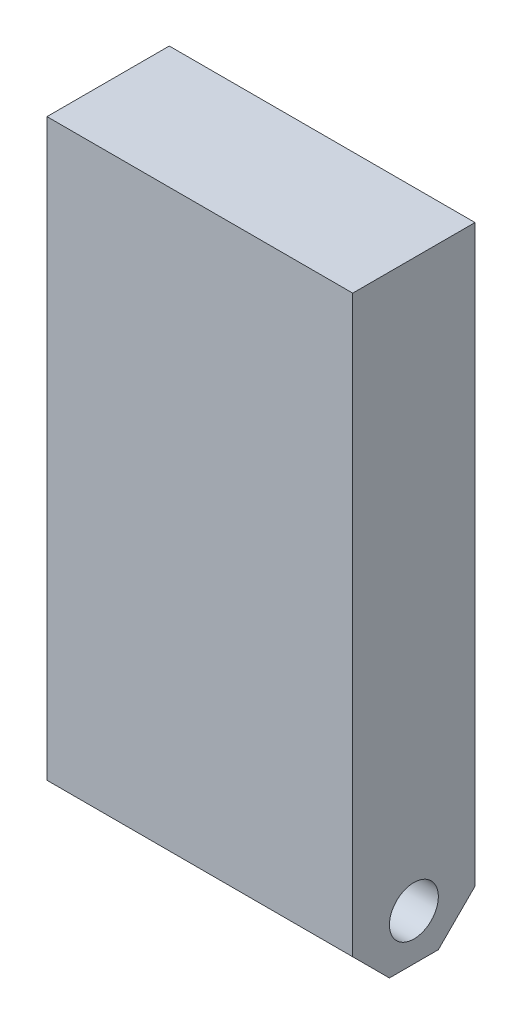
ISO-10303-21;
HEADER;
FILE_DESCRIPTION(('STEP AP214'),'2;1');
FILE_NAME('part.step','',(''),(''),'','','');
FILE_SCHEMA(('AUTOMOTIVE_DESIGN { 1 0 10303 214 1 1 1 1 }'));
ENDSEC;
DATA;
#1=APPLICATION_CONTEXT('core data for automotive mechanical design processes');
#2=APPLICATION_PROTOCOL_DEFINITION('international standard','automotive_design',2000,#1);
#3=PRODUCT_CONTEXT('',#1,'mechanical');
#4=PRODUCT('Part','Part','',(#3));
#5=PRODUCT_RELATED_PRODUCT_CATEGORY('part','',(#4));
#6=PRODUCT_DEFINITION_FORMATION('','',#4);
#7=PRODUCT_DEFINITION_CONTEXT('part definition',#1,'design');
#8=PRODUCT_DEFINITION('design','',#6,#7);
#9=PRODUCT_DEFINITION_SHAPE('','',#8);
#10=(LENGTH_UNIT() NAMED_UNIT(*) SI_UNIT(.MILLI.,.METRE.));
#11=(NAMED_UNIT(*) PLANE_ANGLE_UNIT() SI_UNIT($,.RADIAN.));
#12=(NAMED_UNIT(*) SI_UNIT($,.STERADIAN.) SOLID_ANGLE_UNIT());
#13=UNCERTAINTY_MEASURE_WITH_UNIT(LENGTH_MEASURE(1.E-05),#10,'distance_accuracy_value','');
#14=(GEOMETRIC_REPRESENTATION_CONTEXT(3) GLOBAL_UNCERTAINTY_ASSIGNED_CONTEXT((#13)) GLOBAL_UNIT_ASSIGNED_CONTEXT((#10,
#11,#12)) REPRESENTATION_CONTEXT('',''));
#15=CARTESIAN_POINT('',(0.,0.,0.));
#16=DIRECTION('',(0.,0.,1.));
#17=DIRECTION('',(1.,0.,0.));
#18=AXIS2_PLACEMENT_3D('',#15,#16,#17);
#19=CARTESIAN_POINT('',(25.,0.,10.));
#20=DIRECTION('',(-1.,0.,0.));
#21=DIRECTION('',(0.,-1.,0.));
#22=AXIS2_PLACEMENT_3D('',#19,#20,#21);
#23=PLANE('',#22);
#24=CARTESIAN_POINT('',(25.,7.5225763514201,0.));
#25=DIRECTION('',(-1.,0.,0.));
#26=DIRECTION('',(0.,0.,1.));
#27=AXIS2_PLACEMENT_3D('',#24,#25,#26);
#28=CIRCLE('',#27,4.);
#29=CARTESIAN_POINT('',(25.,7.5225763514201,4.));
#30=VERTEX_POINT('',#29);
#31=EDGE_CURVE('E157',#30,#30,#28,.T.);
#32=ORIENTED_EDGE('',*,*,#31,.T.);
#33=EDGE_LOOP('',(#32));
#34=FACE_BOUND('',#33,.T.);
#35=DIRECTION('',(0.,1.,0.));
#36=VECTOR('',#35,1.);
#37=CARTESIAN_POINT('',(25.,0.,10.));
#38=LINE('',#37,#36);
#39=CARTESIAN_POINT('',(25.,6.00000000000001,10.));
#40=VERTEX_POINT('',#39);
#41=CARTESIAN_POINT('',(25.,100.,10.));
#42=VERTEX_POINT('',#41);
#43=EDGE_CURVE('E93',#40,#42,#38,.T.);
#44=ORIENTED_EDGE('',*,*,#43,.F.);
#45=DIRECTION('',(0.,-0.707106781186547,-0.707106781186549));
#46=VECTOR('',#45,1.);
#47=CARTESIAN_POINT('',(25.,6.00000000000001,10.));
#48=LINE('',#47,#46);
#49=CARTESIAN_POINT('',(25.,0.,3.99999999999998));
#50=VERTEX_POINT('',#49);
#51=EDGE_CURVE('E128',#40,#50,#48,.T.);
#52=ORIENTED_EDGE('',*,*,#51,.T.);
#53=DIRECTION('',(0.,0.,-1.));
#54=VECTOR('',#53,1.);
#55=CARTESIAN_POINT('',(25.,0.,10.));
#56=LINE('',#55,#54);
#57=CARTESIAN_POINT('',(25.,0.,-4.00000000000001));
#58=VERTEX_POINT('',#57);
#59=EDGE_CURVE('E142',#50,#58,#56,.T.);
#60=ORIENTED_EDGE('',*,*,#59,.T.);
#61=DIRECTION('',(0.,-0.707106781186549,0.707106781186546));
#62=VECTOR('',#61,1.);
#63=CARTESIAN_POINT('',(25.,0.,-4.00000000000001));
#64=LINE('',#63,#62);
#65=CARTESIAN_POINT('',(25.,6.00000000000002,-10.));
#66=VERTEX_POINT('',#65);
#67=EDGE_CURVE('E121',#58,#66,#64,.F.);
#68=ORIENTED_EDGE('',*,*,#67,.T.);
#69=DIRECTION('',(0.,1.,0.));
#70=VECTOR('',#69,1.);
#71=CARTESIAN_POINT('',(25.,0.,-10.));
#72=LINE('',#71,#70);
#73=CARTESIAN_POINT('',(25.,100.,-10.));
#74=VERTEX_POINT('',#73);
#75=EDGE_CURVE('E116',#66,#74,#72,.T.);
#76=ORIENTED_EDGE('',*,*,#75,.T.);
#77=DIRECTION('',(0.,0.,-1.));
#78=VECTOR('',#77,1.);
#79=CARTESIAN_POINT('',(25.,100.,10.));
#80=LINE('',#79,#78);
#81=EDGE_CURVE('E109',#42,#74,#80,.T.);
#82=ORIENTED_EDGE('',*,*,#81,.F.);
#83=EDGE_LOOP('',(#44,#52,#60,#68,#76,#82));
#84=FACE_BOUND('',#83,.T.);
#85=ADVANCED_FACE('F37',(#34,#84),#23,.F.);
#86=CARTESIAN_POINT('',(25.,100.,10.));
#87=DIRECTION('',(0.,-1.,0.));
#88=DIRECTION('',(0.,0.,-1.));
#89=AXIS2_PLACEMENT_3D('',#86,#87,#88);
#90=PLANE('',#89);
#91=DIRECTION('',(-1.,0.,0.));
#92=VECTOR('',#91,1.);
#93=CARTESIAN_POINT('',(25.,100.,-10.));
#94=LINE('',#93,#92);
#95=CARTESIAN_POINT('',(-25.,100.,-10.));
#96=VERTEX_POINT('',#95);
#97=EDGE_CURVE('E154',#74,#96,#94,.T.);
#98=ORIENTED_EDGE('',*,*,#97,.T.);
#99=DIRECTION('',(0.,0.,-1.));
#100=VECTOR('',#99,1.);
#101=CARTESIAN_POINT('',(-25.,100.,10.));
#102=LINE('',#101,#100);
#103=CARTESIAN_POINT('',(-25.,100.,10.));
#104=VERTEX_POINT('',#103);
#105=EDGE_CURVE('E111',#104,#96,#102,.T.);
#106=ORIENTED_EDGE('',*,*,#105,.F.);
#107=DIRECTION('',(-1.,0.,0.));
#108=VECTOR('',#107,1.);
#109=CARTESIAN_POINT('',(25.,100.,10.));
#110=LINE('',#109,#108);
#111=EDGE_CURVE('E97',#42,#104,#110,.T.);
#112=ORIENTED_EDGE('',*,*,#111,.F.);
#113=ORIENTED_EDGE('',*,*,#81,.T.);
#114=EDGE_LOOP('',(#98,#106,#112,#113));
#115=FACE_BOUND('',#114,.T.);
#116=ADVANCED_FACE('F108',(#115),#90,.F.);
#117=CARTESIAN_POINT('',(-25.,0.,10.));
#118=DIRECTION('',(1.,0.,0.));
#119=DIRECTION('',(0.,1.,0.));
#120=AXIS2_PLACEMENT_3D('',#117,#118,#119);
#121=PLANE('',#120);
#122=CARTESIAN_POINT('',(-25.,7.5225763514201,0.));
#123=DIRECTION('',(-1.,0.,0.));
#124=DIRECTION('',(0.,0.,1.));
#125=AXIS2_PLACEMENT_3D('',#122,#123,#124);
#126=CIRCLE('',#125,4.);
#127=CARTESIAN_POINT('',(-25.,7.5225763514201,4.));
#128=VERTEX_POINT('',#127);
#129=EDGE_CURVE('E159',#128,#128,#126,.T.);
#130=ORIENTED_EDGE('',*,*,#129,.F.);
#131=EDGE_LOOP('',(#130));
#132=FACE_BOUND('',#131,.T.);
#133=DIRECTION('',(0.,0.,-1.));
#134=VECTOR('',#133,1.);
#135=CARTESIAN_POINT('',(-25.,0.,10.));
#136=LINE('',#135,#134);
#137=CARTESIAN_POINT('',(-25.,0.,3.99999999999998));
#138=VERTEX_POINT('',#137);
#139=CARTESIAN_POINT('',(-25.,0.,-4.00000000000001));
#140=VERTEX_POINT('',#139);
#141=EDGE_CURVE('E123',#138,#140,#136,.T.);
#142=ORIENTED_EDGE('',*,*,#141,.F.);
#143=DIRECTION('',(0.,0.707106781186547,0.707106781186549));
#144=VECTOR('',#143,1.);
#145=CARTESIAN_POINT('',(-25.,6.,10.));
#146=LINE('',#145,#144);
#147=CARTESIAN_POINT('',(-25.,6.,10.));
#148=VERTEX_POINT('',#147);
#149=EDGE_CURVE('E45',#138,#148,#146,.T.);
#150=ORIENTED_EDGE('',*,*,#149,.T.);
#151=DIRECTION('',(0.,-1.,0.));
#152=VECTOR('',#151,1.);
#153=CARTESIAN_POINT('',(-25.,0.,10.));
#154=LINE('',#153,#152);
#155=EDGE_CURVE('E114',#104,#148,#154,.T.);
#156=ORIENTED_EDGE('',*,*,#155,.F.);
#157=ORIENTED_EDGE('',*,*,#105,.T.);
#158=DIRECTION('',(0.,-1.,0.));
#159=VECTOR('',#158,1.);
#160=CARTESIAN_POINT('',(-25.,0.,-10.));
#161=LINE('',#160,#159);
#162=CARTESIAN_POINT('',(-25.,6.00000000000001,-10.));
#163=VERTEX_POINT('',#162);
#164=EDGE_CURVE('E104',#96,#163,#161,.T.);
#165=ORIENTED_EDGE('',*,*,#164,.T.);
#166=DIRECTION('',(0.,0.707106781186549,-0.707106781186546));
#167=VECTOR('',#166,1.);
#168=CARTESIAN_POINT('',(-25.,0.,-4.00000000000001));
#169=LINE('',#168,#167);
#170=EDGE_CURVE('E57',#163,#140,#169,.F.);
#171=ORIENTED_EDGE('',*,*,#170,.T.);
#172=EDGE_LOOP('',(#142,#150,#156,#157,#165,#171));
#173=FACE_BOUND('',#172,.T.);
#174=ADVANCED_FACE('F138',(#132,#173),#121,.F.);
#175=CARTESIAN_POINT('',(25.,0.,10.));
#176=DIRECTION('',(0.,1.,0.));
#177=DIRECTION('',(-1.,0.,0.));
#178=AXIS2_PLACEMENT_3D('',#175,#176,#177);
#179=PLANE('',#178);
#180=ORIENTED_EDGE('',*,*,#59,.F.);
#181=DIRECTION('',(-1.,0.,0.));
#182=VECTOR('',#181,1.);
#183=CARTESIAN_POINT('',(-25.,0.,3.99999999999998));
#184=LINE('',#183,#182);
#185=EDGE_CURVE('E133',#50,#138,#184,.T.);
#186=ORIENTED_EDGE('',*,*,#185,.T.);
#187=ORIENTED_EDGE('',*,*,#141,.T.);
#188=DIRECTION('',(1.,0.,0.));
#189=VECTOR('',#188,1.);
#190=CARTESIAN_POINT('',(25.,0.,-4.00000000000001));
#191=LINE('',#190,#189);
#192=EDGE_CURVE('E130',#140,#58,#191,.T.);
#193=ORIENTED_EDGE('',*,*,#192,.T.);
#194=EDGE_LOOP('',(#180,#186,#187,#193));
#195=FACE_BOUND('',#194,.T.);
#196=ADVANCED_FACE('F148',(#195),#179,.F.);
#197=CARTESIAN_POINT('',(25.,100.,10.));
#198=DIRECTION('',(0.,0.,1.));
#199=DIRECTION('',(1.,0.,0.));
#200=AXIS2_PLACEMENT_3D('',#197,#198,#199);
#201=PLANE('',#200);
#202=ORIENTED_EDGE('',*,*,#155,.T.);
#203=DIRECTION('',(1.,0.,0.));
#204=VECTOR('',#203,1.);
#205=CARTESIAN_POINT('',(25.,6.00000000000001,10.));
#206=LINE('',#205,#204);
#207=EDGE_CURVE('E100',#148,#40,#206,.T.);
#208=ORIENTED_EDGE('',*,*,#207,.T.);
#209=ORIENTED_EDGE('',*,*,#43,.T.);
#210=ORIENTED_EDGE('',*,*,#111,.T.);
#211=EDGE_LOOP('',(#202,#208,#209,#210));
#212=FACE_BOUND('',#211,.T.);
#213=ADVANCED_FACE('F96',(#212),#201,.T.);
#214=CARTESIAN_POINT('',(25.,100.,-10.));
#215=DIRECTION('',(0.,0.,1.));
#216=DIRECTION('',(1.,0.,0.));
#217=AXIS2_PLACEMENT_3D('',#214,#215,#216);
#218=PLANE('',#217);
#219=ORIENTED_EDGE('',*,*,#75,.F.);
#220=DIRECTION('',(-1.,0.,0.));
#221=VECTOR('',#220,1.);
#222=CARTESIAN_POINT('',(25.,6.00000000000002,-10.));
#223=LINE('',#222,#221);
#224=EDGE_CURVE('E11',#66,#163,#223,.T.);
#225=ORIENTED_EDGE('',*,*,#224,.T.);
#226=ORIENTED_EDGE('',*,*,#164,.F.);
#227=ORIENTED_EDGE('',*,*,#97,.F.);
#228=EDGE_LOOP('',(#219,#225,#226,#227));
#229=FACE_BOUND('',#228,.T.);
#230=ADVANCED_FACE('F170',(#229),#218,.F.);
#231=CARTESIAN_POINT('',(25.,7.5225763514201,0.));
#232=DIRECTION('',(-1.,0.,0.));
#233=DIRECTION('',(0.,0.,1.));
#234=AXIS2_PLACEMENT_3D('',#231,#232,#233);
#235=CYLINDRICAL_SURFACE('',#234,4.);
#236=ORIENTED_EDGE('',*,*,#31,.F.);
#237=EDGE_LOOP('',(#236));
#238=FACE_BOUND('',#237,.T.);
#239=ORIENTED_EDGE('',*,*,#129,.T.);
#240=EDGE_LOOP('',(#239));
#241=FACE_BOUND('',#240,.T.);
#242=ADVANCED_FACE('F167',(#238,#241),#235,.F.);
#243=CARTESIAN_POINT('',(25.,6.00000000000001,10.));
#244=DIRECTION('',(0.,-0.707106781186549,0.707106781186547));
#245=DIRECTION('',(0.,-0.707106781186547,-0.707106781186549));
#246=AXIS2_PLACEMENT_3D('',#243,#244,#245);
#247=PLANE('',#246);
#248=ORIENTED_EDGE('',*,*,#149,.F.);
#249=ORIENTED_EDGE('',*,*,#185,.F.);
#250=ORIENTED_EDGE('',*,*,#51,.F.);
#251=ORIENTED_EDGE('',*,*,#207,.F.);
#252=EDGE_LOOP('',(#248,#249,#250,#251));
#253=FACE_BOUND('',#252,.T.);
#254=ADVANCED_FACE('F144',(#253),#247,.T.);
#255=CARTESIAN_POINT('',(25.,0.,-4.00000000000001));
#256=DIRECTION('',(0.,0.707106781186546,0.707106781186549));
#257=DIRECTION('',(0.,-0.707106781186549,0.707106781186546));
#258=AXIS2_PLACEMENT_3D('',#255,#256,#257);
#259=PLANE('',#258);
#260=ORIENTED_EDGE('',*,*,#170,.F.);
#261=ORIENTED_EDGE('',*,*,#224,.F.);
#262=ORIENTED_EDGE('',*,*,#67,.F.);
#263=ORIENTED_EDGE('',*,*,#192,.F.);
#264=EDGE_LOOP('',(#260,#261,#262,#263));
#265=FACE_BOUND('',#264,.T.);
#266=ADVANCED_FACE('F39',(#265),#259,.F.);
#267=CLOSED_SHELL('',(#85,#116,#174,#196,#213,#230,#242,#254,#266));
#268=MANIFOLD_SOLID_BREP('B2',#267);
#269=ADVANCED_BREP_SHAPE_REPRESENTATION('',(#18,#268),#14);
#270=SHAPE_DEFINITION_REPRESENTATION(#9,#269);
ENDSEC;
END-ISO-10303-21;
